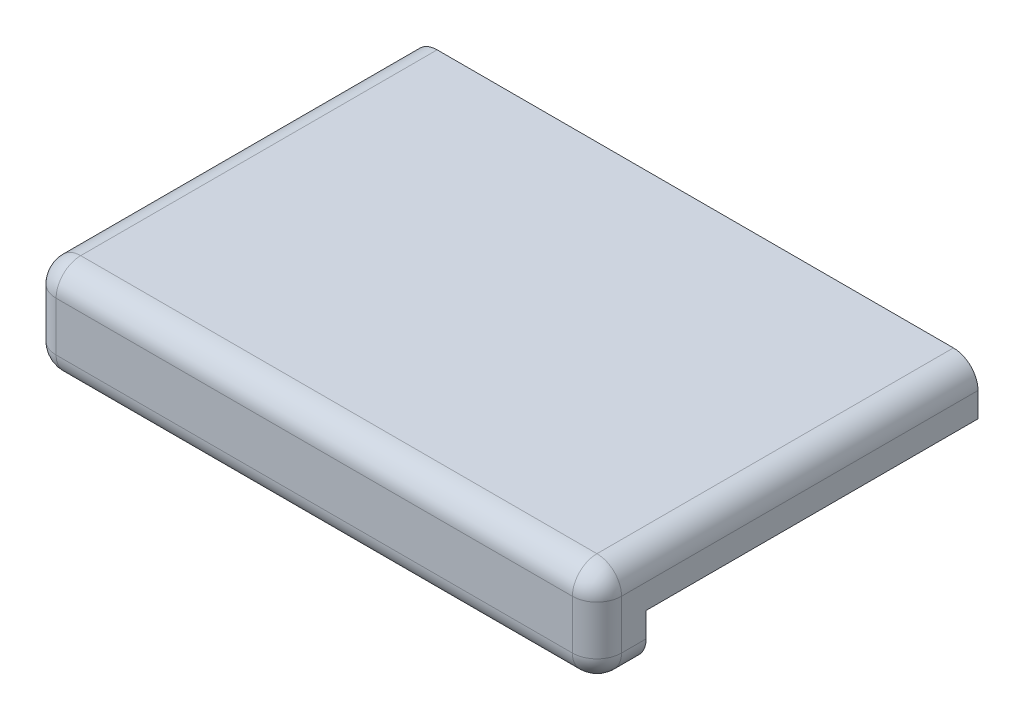
ISO-10303-21;
HEADER;
FILE_DESCRIPTION(('STEP AP214'),'2;1');
FILE_NAME('part.step','',(''),(''),'','','');
FILE_SCHEMA(('AUTOMOTIVE_DESIGN { 1 0 10303 214 1 1 1 1 }'));
ENDSEC;
DATA;
#1=APPLICATION_CONTEXT('core data for automotive mechanical design processes');
#2=APPLICATION_PROTOCOL_DEFINITION('international standard','automotive_design',2000,#1);
#3=PRODUCT_CONTEXT('',#1,'mechanical');
#4=PRODUCT('Part','Part','',(#3));
#5=PRODUCT_RELATED_PRODUCT_CATEGORY('part','',(#4));
#6=PRODUCT_DEFINITION_FORMATION('','',#4);
#7=PRODUCT_DEFINITION_CONTEXT('part definition',#1,'design');
#8=PRODUCT_DEFINITION('design','',#6,#7);
#9=PRODUCT_DEFINITION_SHAPE('','',#8);
#10=(LENGTH_UNIT() NAMED_UNIT(*) SI_UNIT(.MILLI.,.METRE.));
#11=(NAMED_UNIT(*) PLANE_ANGLE_UNIT() SI_UNIT($,.RADIAN.));
#12=(NAMED_UNIT(*) SI_UNIT($,.STERADIAN.) SOLID_ANGLE_UNIT());
#13=UNCERTAINTY_MEASURE_WITH_UNIT(LENGTH_MEASURE(1.E-05),#10,'distance_accuracy_value','');
#14=(GEOMETRIC_REPRESENTATION_CONTEXT(3) GLOBAL_UNCERTAINTY_ASSIGNED_CONTEXT((#13)) GLOBAL_UNIT_ASSIGNED_CONTEXT((#10,
#11,#12)) REPRESENTATION_CONTEXT('',''));
#15=CARTESIAN_POINT('',(0.,0.,0.));
#16=DIRECTION('',(0.,0.,1.));
#17=DIRECTION('',(1.,0.,0.));
#18=AXIS2_PLACEMENT_3D('',#15,#16,#17);
#19=CARTESIAN_POINT('',(-9.24999999999999,20.,-29.));
#20=DIRECTION('',(1.,0.,0.));
#21=DIRECTION('',(0.,0.,-1.));
#22=AXIS2_PLACEMENT_3D('',#19,#20,#21);
#23=SPHERICAL_SURFACE('',#22,2.);
#24=CARTESIAN_POINT('',(-9.24999999999999,20.,-29.));
#25=DIRECTION('',(0.,0.,-1.));
#26=DIRECTION('',(-1.,0.,0.));
#27=AXIS2_PLACEMENT_3D('',#24,#25,#26);
#28=CIRCLE('',#27,2.);
#29=CARTESIAN_POINT('',(-9.24999999999999,18.,-29.));
#30=VERTEX_POINT('',#29);
#31=CARTESIAN_POINT('',(-11.25,20.,-29.));
#32=VERTEX_POINT('',#31);
#33=EDGE_CURVE('E11',#30,#32,#28,.T.);
#34=ORIENTED_EDGE('',*,*,#33,.F.);
#35=CARTESIAN_POINT('',(-9.24999999999999,20.,-29.));
#36=DIRECTION('',(-1.,0.,0.));
#37=DIRECTION('',(0.,0.,1.));
#38=AXIS2_PLACEMENT_3D('',#35,#36,#37);
#39=CIRCLE('',#38,2.);
#40=CARTESIAN_POINT('',(-9.24999999999999,20.,-27.));
#41=VERTEX_POINT('',#40);
#42=EDGE_CURVE('E233',#41,#30,#39,.F.);
#43=ORIENTED_EDGE('',*,*,#42,.F.);
#44=CARTESIAN_POINT('',(-9.24999999999999,20.,-29.));
#45=DIRECTION('',(0.,-1.,0.));
#46=DIRECTION('',(0.,0.,-1.));
#47=AXIS2_PLACEMENT_3D('',#44,#45,#46);
#48=CIRCLE('',#47,2.);
#49=EDGE_CURVE('E46',#41,#32,#48,.T.);
#50=ORIENTED_EDGE('',*,*,#49,.T.);
#51=EDGE_LOOP('',(#34,#43,#50));
#52=FACE_BOUND('',#51,.T.);
#53=ADVANCED_FACE('F38',(#52),#23,.T.);
#54=CARTESIAN_POINT('',(-9.24999999999999,26.,-29.));
#55=DIRECTION('',(0.,-1.,0.));
#56=DIRECTION('',(0.,0.,-1.));
#57=AXIS2_PLACEMENT_3D('',#54,#55,#56);
#58=CYLINDRICAL_SURFACE('',#57,2.);
#59=ORIENTED_EDGE('',*,*,#49,.F.);
#60=DIRECTION('',(0.,-1.,0.));
#61=VECTOR('',#60,1.);
#62=CARTESIAN_POINT('',(-9.24999999999999,26.,-27.));
#63=LINE('',#62,#61);
#64=CARTESIAN_POINT('',(-9.24999999999999,24.,-27.));
#65=VERTEX_POINT('',#64);
#66=EDGE_CURVE('E230',#65,#41,#63,.T.);
#67=ORIENTED_EDGE('',*,*,#66,.F.);
#68=CARTESIAN_POINT('',(-9.24999999999999,24.,-29.));
#69=DIRECTION('',(0.,-1.,0.));
#70=DIRECTION('',(0.,0.,-1.));
#71=AXIS2_PLACEMENT_3D('',#68,#69,#70);
#72=CIRCLE('',#71,2.);
#73=CARTESIAN_POINT('',(-11.25,24.,-29.));
#74=VERTEX_POINT('',#73);
#75=EDGE_CURVE('E242',#65,#74,#72,.T.);
#76=ORIENTED_EDGE('',*,*,#75,.T.);
#77=DIRECTION('',(0.,-1.,0.));
#78=VECTOR('',#77,1.);
#79=CARTESIAN_POINT('',(-11.25,26.,-29.));
#80=LINE('',#79,#78);
#81=EDGE_CURVE('E219',#32,#74,#80,.F.);
#82=ORIENTED_EDGE('',*,*,#81,.F.);
#83=EDGE_LOOP('',(#59,#67,#76,#82));
#84=FACE_BOUND('',#83,.T.);
#85=ADVANCED_FACE('F246',(#84),#58,.T.);
#86=CARTESIAN_POINT('',(-9.24999999999999,24.,-29.));
#87=DIRECTION('',(1.,0.,0.));
#88=DIRECTION('',(0.,0.,-1.));
#89=AXIS2_PLACEMENT_3D('',#86,#87,#88);
#90=SPHERICAL_SURFACE('',#89,2.);
#91=ORIENTED_EDGE('',*,*,#75,.F.);
#92=CARTESIAN_POINT('',(-9.24999999999999,24.,-29.));
#93=DIRECTION('',(1.,0.,0.));
#94=DIRECTION('',(0.,0.,-1.));
#95=AXIS2_PLACEMENT_3D('',#92,#93,#94);
#96=CIRCLE('',#95,2.);
#97=CARTESIAN_POINT('',(-9.24999999999999,26.,-29.));
#98=VERTEX_POINT('',#97);
#99=EDGE_CURVE('E227',#98,#65,#96,.T.);
#100=ORIENTED_EDGE('',*,*,#99,.F.);
#101=CARTESIAN_POINT('',(-9.24999999999999,24.,-29.));
#102=DIRECTION('',(0.,0.,1.));
#103=DIRECTION('',(1.,0.,0.));
#104=AXIS2_PLACEMENT_3D('',#101,#102,#103);
#105=CIRCLE('',#104,2.);
#106=EDGE_CURVE('E239',#98,#74,#105,.T.);
#107=ORIENTED_EDGE('',*,*,#106,.T.);
#108=EDGE_LOOP('',(#91,#100,#107));
#109=FACE_BOUND('',#108,.T.);
#110=ADVANCED_FACE('F278',(#109),#90,.T.);
#111=CARTESIAN_POINT('',(-9.24999999999998,24.,0.));
#112=DIRECTION('',(0.,0.,-1.));
#113=DIRECTION('',(-1.,0.,0.));
#114=AXIS2_PLACEMENT_3D('',#111,#112,#113);
#115=CYLINDRICAL_SURFACE('',#114,2.);
#116=ORIENTED_EDGE('',*,*,#106,.F.);
#117=DIRECTION('',(0.,0.,1.));
#118=VECTOR('',#117,1.);
#119=CARTESIAN_POINT('',(-9.24999999999998,26.,0.));
#120=LINE('',#119,#118);
#121=CARTESIAN_POINT('',(-9.24999999999999,26.,-58.));
#122=VERTEX_POINT('',#121);
#123=EDGE_CURVE('E213',#122,#98,#120,.T.);
#124=ORIENTED_EDGE('',*,*,#123,.F.);
#125=CARTESIAN_POINT('',(-9.24999999999999,24.,-58.));
#126=DIRECTION('',(0.,0.,1.));
#127=DIRECTION('',(1.,0.,0.));
#128=AXIS2_PLACEMENT_3D('',#125,#126,#127);
#129=CIRCLE('',#128,2.);
#130=CARTESIAN_POINT('',(-11.25,24.,-58.));
#131=VERTEX_POINT('',#130);
#132=EDGE_CURVE('E225',#131,#122,#129,.F.);
#133=ORIENTED_EDGE('',*,*,#132,.F.);
#134=DIRECTION('',(0.,0.,1.));
#135=VECTOR('',#134,1.);
#136=CARTESIAN_POINT('',(-11.25,24.,0.));
#137=LINE('',#136,#135);
#138=EDGE_CURVE('E222',#74,#131,#137,.F.);
#139=ORIENTED_EDGE('',*,*,#138,.F.);
#140=EDGE_LOOP('',(#116,#124,#133,#139));
#141=FACE_BOUND('',#140,.T.);
#142=ADVANCED_FACE('F285',(#141),#115,.T.);
#143=CARTESIAN_POINT('',(-9.24999999999998,20.,0.));
#144=DIRECTION('',(0.,0.,1.));
#145=DIRECTION('',(1.,0.,0.));
#146=AXIS2_PLACEMENT_3D('',#143,#144,#145);
#147=CYLINDRICAL_SURFACE('',#146,2.);
#148=DIRECTION('',(0.,0.,-1.));
#149=VECTOR('',#148,1.);
#150=CARTESIAN_POINT('',(-9.24999999999998,18.,0.));
#151=LINE('',#150,#149);
#152=CARTESIAN_POINT('',(-9.24999999999999,18.,-31.));
#153=VERTEX_POINT('',#152);
#154=EDGE_CURVE('E236',#30,#153,#151,.T.);
#155=ORIENTED_EDGE('',*,*,#154,.F.);
#156=ORIENTED_EDGE('',*,*,#33,.T.);
#157=DIRECTION('',(0.,0.,-1.));
#158=VECTOR('',#157,1.);
#159=CARTESIAN_POINT('',(-11.25,20.,0.));
#160=LINE('',#159,#158);
#161=CARTESIAN_POINT('',(-11.25,20.,-31.));
#162=VERTEX_POINT('',#161);
#163=EDGE_CURVE('E216',#162,#32,#160,.F.);
#164=ORIENTED_EDGE('',*,*,#163,.F.);
#165=CARTESIAN_POINT('',(-9.24999999999999,20.,-31.));
#166=DIRECTION('',(0.,0.,1.));
#167=DIRECTION('',(1.,0.,0.));
#168=AXIS2_PLACEMENT_3D('',#165,#166,#167);
#169=CIRCLE('',#168,2.);
#170=EDGE_CURVE('E53',#153,#162,#169,.F.);
#171=ORIENTED_EDGE('',*,*,#170,.F.);
#172=EDGE_LOOP('',(#155,#156,#164,#171));
#173=FACE_BOUND('',#172,.T.);
#174=ADVANCED_FACE('F40',(#173),#147,.T.);
#175=CARTESIAN_POINT('',(32.75,20.,-29.));
#176=DIRECTION('',(-1.,0.,0.));
#177=DIRECTION('',(0.,0.,1.));
#178=AXIS2_PLACEMENT_3D('',#175,#176,#177);
#179=SPHERICAL_SURFACE('',#178,2.);
#180=CARTESIAN_POINT('',(32.75,20.,-29.));
#181=DIRECTION('',(0.,0.,-1.));
#182=DIRECTION('',(-1.,0.,0.));
#183=AXIS2_PLACEMENT_3D('',#180,#181,#182);
#184=CIRCLE('',#183,2.);
#185=CARTESIAN_POINT('',(34.75,20.,-29.));
#186=VERTEX_POINT('',#185);
#187=CARTESIAN_POINT('',(32.75,18.,-29.));
#188=VERTEX_POINT('',#187);
#189=EDGE_CURVE('E211',#186,#188,#184,.T.);
#190=ORIENTED_EDGE('',*,*,#189,.F.);
#191=CARTESIAN_POINT('',(32.75,20.,-29.));
#192=DIRECTION('',(0.,-1.,0.));
#193=DIRECTION('',(0.,0.,-1.));
#194=AXIS2_PLACEMENT_3D('',#191,#192,#193);
#195=CIRCLE('',#194,2.);
#196=CARTESIAN_POINT('',(32.75,20.,-27.));
#197=VERTEX_POINT('',#196);
#198=EDGE_CURVE('E208',#186,#197,#195,.T.);
#199=ORIENTED_EDGE('',*,*,#198,.T.);
#200=CARTESIAN_POINT('',(32.75,20.,-29.));
#201=DIRECTION('',(-1.,0.,0.));
#202=DIRECTION('',(0.,0.,1.));
#203=AXIS2_PLACEMENT_3D('',#200,#201,#202);
#204=CIRCLE('',#203,2.);
#205=EDGE_CURVE('E195',#188,#197,#204,.T.);
#206=ORIENTED_EDGE('',*,*,#205,.F.);
#207=EDGE_LOOP('',(#190,#199,#206));
#208=FACE_BOUND('',#207,.T.);
#209=ADVANCED_FACE('F259',(#208),#179,.T.);
#210=CARTESIAN_POINT('',(32.75,26.,-29.));
#211=DIRECTION('',(0.,-1.,0.));
#212=DIRECTION('',(0.,0.,-1.));
#213=AXIS2_PLACEMENT_3D('',#210,#211,#212);
#214=CYLINDRICAL_SURFACE('',#213,2.);
#215=ORIENTED_EDGE('',*,*,#198,.F.);
#216=DIRECTION('',(0.,-1.,0.));
#217=VECTOR('',#216,1.);
#218=CARTESIAN_POINT('',(34.75,26.,-29.));
#219=LINE('',#218,#217);
#220=CARTESIAN_POINT('',(34.75,24.,-29.));
#221=VERTEX_POINT('',#220);
#222=EDGE_CURVE('E179',#221,#186,#219,.T.);
#223=ORIENTED_EDGE('',*,*,#222,.F.);
#224=CARTESIAN_POINT('',(32.75,24.,-29.));
#225=DIRECTION('',(0.,-1.,0.));
#226=DIRECTION('',(0.,0.,-1.));
#227=AXIS2_PLACEMENT_3D('',#224,#225,#226);
#228=CIRCLE('',#227,2.);
#229=CARTESIAN_POINT('',(32.75,24.,-27.));
#230=VERTEX_POINT('',#229);
#231=EDGE_CURVE('E206',#221,#230,#228,.T.);
#232=ORIENTED_EDGE('',*,*,#231,.T.);
#233=DIRECTION('',(0.,-1.,0.));
#234=VECTOR('',#233,1.);
#235=CARTESIAN_POINT('',(32.75,26.,-27.));
#236=LINE('',#235,#234);
#237=EDGE_CURVE('E192',#197,#230,#236,.F.);
#238=ORIENTED_EDGE('',*,*,#237,.F.);
#239=EDGE_LOOP('',(#215,#223,#232,#238));
#240=FACE_BOUND('',#239,.T.);
#241=ADVANCED_FACE('F263',(#240),#214,.T.);
#242=CARTESIAN_POINT('',(32.75,24.,-29.));
#243=DIRECTION('',(-1.,0.,0.));
#244=DIRECTION('',(0.,0.,1.));
#245=AXIS2_PLACEMENT_3D('',#242,#243,#244);
#246=SPHERICAL_SURFACE('',#245,2.);
#247=ORIENTED_EDGE('',*,*,#231,.F.);
#248=CARTESIAN_POINT('',(32.75,24.,-29.));
#249=DIRECTION('',(0.,0.,1.));
#250=DIRECTION('',(1.,0.,0.));
#251=AXIS2_PLACEMENT_3D('',#248,#249,#250);
#252=CIRCLE('',#251,2.);
#253=CARTESIAN_POINT('',(32.75,26.,-29.));
#254=VERTEX_POINT('',#253);
#255=EDGE_CURVE('E203',#221,#254,#252,.T.);
#256=ORIENTED_EDGE('',*,*,#255,.T.);
#257=CARTESIAN_POINT('',(32.75,24.,-29.));
#258=DIRECTION('',(1.,0.,0.));
#259=DIRECTION('',(0.,0.,-1.));
#260=AXIS2_PLACEMENT_3D('',#257,#258,#259);
#261=CIRCLE('',#260,2.);
#262=EDGE_CURVE('E189',#230,#254,#261,.F.);
#263=ORIENTED_EDGE('',*,*,#262,.F.);
#264=EDGE_LOOP('',(#247,#256,#263));
#265=FACE_BOUND('',#264,.T.);
#266=ADVANCED_FACE('F270',(#265),#246,.T.);
#267=CARTESIAN_POINT('',(32.75,24.,-58.));
#268=DIRECTION('',(0.,0.,-1.));
#269=DIRECTION('',(-1.,0.,0.));
#270=AXIS2_PLACEMENT_3D('',#267,#268,#269);
#271=CYLINDRICAL_SURFACE('',#270,2.);
#272=ORIENTED_EDGE('',*,*,#255,.F.);
#273=DIRECTION('',(0.,0.,1.));
#274=VECTOR('',#273,1.);
#275=CARTESIAN_POINT('',(34.75,24.,-58.));
#276=LINE('',#275,#274);
#277=CARTESIAN_POINT('',(34.75,24.,-58.));
#278=VERTEX_POINT('',#277);
#279=EDGE_CURVE('E181',#278,#221,#276,.T.);
#280=ORIENTED_EDGE('',*,*,#279,.F.);
#281=CARTESIAN_POINT('',(32.75,24.,-58.));
#282=DIRECTION('',(0.,0.,1.));
#283=DIRECTION('',(1.,0.,0.));
#284=AXIS2_PLACEMENT_3D('',#281,#282,#283);
#285=CIRCLE('',#284,2.);
#286=CARTESIAN_POINT('',(32.75,26.,-58.));
#287=VERTEX_POINT('',#286);
#288=EDGE_CURVE('E187',#287,#278,#285,.F.);
#289=ORIENTED_EDGE('',*,*,#288,.F.);
#290=DIRECTION('',(0.,0.,1.));
#291=VECTOR('',#290,1.);
#292=CARTESIAN_POINT('',(32.75,26.,-58.));
#293=LINE('',#292,#291);
#294=EDGE_CURVE('E184',#254,#287,#293,.F.);
#295=ORIENTED_EDGE('',*,*,#294,.F.);
#296=EDGE_LOOP('',(#272,#280,#289,#295));
#297=FACE_BOUND('',#296,.T.);
#298=ADVANCED_FACE('F291',(#297),#271,.T.);
#299=CARTESIAN_POINT('',(32.75,20.,-58.));
#300=DIRECTION('',(0.,0.,1.));
#301=DIRECTION('',(1.,0.,0.));
#302=AXIS2_PLACEMENT_3D('',#299,#300,#301);
#303=CYLINDRICAL_SURFACE('',#302,2.);
#304=DIRECTION('',(0.,0.,-1.));
#305=VECTOR('',#304,1.);
#306=CARTESIAN_POINT('',(34.75,20.,-58.));
#307=LINE('',#306,#305);
#308=CARTESIAN_POINT('',(34.75,20.,-31.));
#309=VERTEX_POINT('',#308);
#310=EDGE_CURVE('E135',#186,#309,#307,.T.);
#311=ORIENTED_EDGE('',*,*,#310,.F.);
#312=ORIENTED_EDGE('',*,*,#189,.T.);
#313=DIRECTION('',(0.,0.,-1.));
#314=VECTOR('',#313,1.);
#315=CARTESIAN_POINT('',(32.75,18.,-58.));
#316=LINE('',#315,#314);
#317=CARTESIAN_POINT('',(32.75,18.,-31.));
#318=VERTEX_POINT('',#317);
#319=EDGE_CURVE('E198',#318,#188,#316,.F.);
#320=ORIENTED_EDGE('',*,*,#319,.F.);
#321=CARTESIAN_POINT('',(32.75,20.,-31.));
#322=DIRECTION('',(0.,0.,1.));
#323=DIRECTION('',(1.,0.,0.));
#324=AXIS2_PLACEMENT_3D('',#321,#322,#323);
#325=CIRCLE('',#324,2.);
#326=EDGE_CURVE('E201',#309,#318,#325,.F.);
#327=ORIENTED_EDGE('',*,*,#326,.F.);
#328=EDGE_LOOP('',(#311,#312,#320,#327));
#329=FACE_BOUND('',#328,.T.);
#330=ADVANCED_FACE('F293',(#329),#303,.T.);
#331=CARTESIAN_POINT('',(-11.25,20.,-29.));
#332=DIRECTION('',(-1.,0.,0.));
#333=DIRECTION('',(0.,0.,1.));
#334=AXIS2_PLACEMENT_3D('',#331,#332,#333);
#335=CYLINDRICAL_SURFACE('',#334,2.);
#336=DIRECTION('',(1.,0.,0.));
#337=VECTOR('',#336,1.);
#338=CARTESIAN_POINT('',(-11.25,20.,-27.));
#339=LINE('',#338,#337);
#340=EDGE_CURVE('E173',#41,#197,#339,.T.);
#341=ORIENTED_EDGE('',*,*,#340,.F.);
#342=ORIENTED_EDGE('',*,*,#42,.T.);
#343=DIRECTION('',(1.,0.,0.));
#344=VECTOR('',#343,1.);
#345=CARTESIAN_POINT('',(-11.25,18.,-29.));
#346=LINE('',#345,#344);
#347=EDGE_CURVE('E175',#188,#30,#346,.F.);
#348=ORIENTED_EDGE('',*,*,#347,.F.);
#349=ORIENTED_EDGE('',*,*,#205,.T.);
#350=EDGE_LOOP('',(#341,#342,#348,#349));
#351=FACE_BOUND('',#350,.T.);
#352=ADVANCED_FACE('F253',(#351),#335,.T.);
#353=CARTESIAN_POINT('',(-11.25,24.,-29.));
#354=DIRECTION('',(1.,0.,0.));
#355=DIRECTION('',(0.,0.,-1.));
#356=AXIS2_PLACEMENT_3D('',#353,#354,#355);
#357=CYLINDRICAL_SURFACE('',#356,2.);
#358=DIRECTION('',(-1.,0.,0.));
#359=VECTOR('',#358,1.);
#360=CARTESIAN_POINT('',(-11.25,26.,-29.));
#361=LINE('',#360,#359);
#362=EDGE_CURVE('E171',#98,#254,#361,.F.);
#363=ORIENTED_EDGE('',*,*,#362,.F.);
#364=ORIENTED_EDGE('',*,*,#99,.T.);
#365=DIRECTION('',(-1.,0.,0.));
#366=VECTOR('',#365,1.);
#367=CARTESIAN_POINT('',(-11.25,24.,-27.));
#368=LINE('',#367,#366);
#369=EDGE_CURVE('E168',#230,#65,#368,.T.);
#370=ORIENTED_EDGE('',*,*,#369,.F.);
#371=ORIENTED_EDGE('',*,*,#262,.T.);
#372=EDGE_LOOP('',(#363,#364,#370,#371));
#373=FACE_BOUND('',#372,.T.);
#374=ADVANCED_FACE('F275',(#373),#357,.T.);
#375=CARTESIAN_POINT('',(0.,22.,0.));
#376=DIRECTION('',(0.,1.,0.));
#377=DIRECTION('',(0.,0.,1.));
#378=AXIS2_PLACEMENT_3D('',#375,#376,#377);
#379=PLANE('',#378);
#380=DIRECTION('',(1.,0.,0.));
#381=VECTOR('',#380,1.);
#382=CARTESIAN_POINT('',(-11.25,22.,-31.));
#383=LINE('',#382,#381);
#384=CARTESIAN_POINT('',(-11.25,22.,-31.));
#385=VERTEX_POINT('',#384);
#386=CARTESIAN_POINT('',(34.75,22.,-31.));
#387=VERTEX_POINT('',#386);
#388=EDGE_CURVE('E146',#385,#387,#383,.T.);
#389=ORIENTED_EDGE('',*,*,#388,.F.);
#390=DIRECTION('',(0.,0.,1.));
#391=VECTOR('',#390,1.);
#392=CARTESIAN_POINT('',(-11.25,22.,-58.));
#393=LINE('',#392,#391);
#394=CARTESIAN_POINT('',(-11.25,22.,-58.));
#395=VERTEX_POINT('',#394);
#396=EDGE_CURVE('E150',#395,#385,#393,.T.);
#397=ORIENTED_EDGE('',*,*,#396,.F.);
#398=DIRECTION('',(-1.,0.,0.));
#399=VECTOR('',#398,1.);
#400=CARTESIAN_POINT('',(-11.25,22.,-58.));
#401=LINE('',#400,#399);
#402=CARTESIAN_POINT('',(34.75,22.,-58.));
#403=VERTEX_POINT('',#402);
#404=EDGE_CURVE('E149',#403,#395,#401,.T.);
#405=ORIENTED_EDGE('',*,*,#404,.F.);
#406=DIRECTION('',(0.,0.,-1.));
#407=VECTOR('',#406,1.);
#408=CARTESIAN_POINT('',(34.75,22.,-58.));
#409=LINE('',#408,#407);
#410=EDGE_CURVE('E131',#387,#403,#409,.T.);
#411=ORIENTED_EDGE('',*,*,#410,.F.);
#412=EDGE_LOOP('',(#389,#397,#405,#411));
#413=FACE_BOUND('',#412,.T.);
#414=ADVANCED_FACE('F144',(#413),#379,.F.);
#415=CARTESIAN_POINT('',(-11.25,26.,-58.));
#416=DIRECTION('',(1.,0.,0.));
#417=DIRECTION('',(0.,0.,-1.));
#418=AXIS2_PLACEMENT_3D('',#415,#416,#417);
#419=PLANE('',#418);
#420=ORIENTED_EDGE('',*,*,#81,.T.);
#421=ORIENTED_EDGE('',*,*,#138,.T.);
#422=DIRECTION('',(0.,-1.,0.));
#423=VECTOR('',#422,1.);
#424=CARTESIAN_POINT('',(-11.25,26.,-58.));
#425=LINE('',#424,#423);
#426=EDGE_CURVE('E162',#131,#395,#425,.T.);
#427=ORIENTED_EDGE('',*,*,#426,.T.);
#428=ORIENTED_EDGE('',*,*,#396,.T.);
#429=DIRECTION('',(0.,1.,0.));
#430=VECTOR('',#429,1.);
#431=CARTESIAN_POINT('',(-11.25,18.,-31.));
#432=LINE('',#431,#430);
#433=EDGE_CURVE('E139',#162,#385,#432,.T.);
#434=ORIENTED_EDGE('',*,*,#433,.F.);
#435=ORIENTED_EDGE('',*,*,#163,.T.);
#436=EDGE_LOOP('',(#420,#421,#427,#428,#434,#435));
#437=FACE_BOUND('',#436,.T.);
#438=ADVANCED_FACE('F248',(#437),#419,.F.);
#439=CARTESIAN_POINT('',(-11.25,26.,-27.));
#440=DIRECTION('',(0.,0.,-1.));
#441=DIRECTION('',(-1.,0.,0.));
#442=AXIS2_PLACEMENT_3D('',#439,#440,#441);
#443=PLANE('',#442);
#444=ORIENTED_EDGE('',*,*,#369,.T.);
#445=ORIENTED_EDGE('',*,*,#66,.T.);
#446=ORIENTED_EDGE('',*,*,#340,.T.);
#447=ORIENTED_EDGE('',*,*,#237,.T.);
#448=EDGE_LOOP('',(#444,#445,#446,#447));
#449=FACE_BOUND('',#448,.T.);
#450=ADVANCED_FACE('F267',(#449),#443,.F.);
#451=CARTESIAN_POINT('',(34.75,26.,-58.));
#452=DIRECTION('',(-1.,0.,0.));
#453=DIRECTION('',(0.,0.,1.));
#454=AXIS2_PLACEMENT_3D('',#451,#452,#453);
#455=PLANE('',#454);
#456=DIRECTION('',(0.,-1.,0.));
#457=VECTOR('',#456,1.);
#458=CARTESIAN_POINT('',(34.75,26.,-58.));
#459=LINE('',#458,#457);
#460=EDGE_CURVE('E166',#278,#403,#459,.T.);
#461=ORIENTED_EDGE('',*,*,#460,.F.);
#462=ORIENTED_EDGE('',*,*,#279,.T.);
#463=ORIENTED_EDGE('',*,*,#222,.T.);
#464=ORIENTED_EDGE('',*,*,#310,.T.);
#465=DIRECTION('',(0.,1.,0.));
#466=VECTOR('',#465,1.);
#467=CARTESIAN_POINT('',(34.75,18.,-31.));
#468=LINE('',#467,#466);
#469=EDGE_CURVE('E127',#309,#387,#468,.T.);
#470=ORIENTED_EDGE('',*,*,#469,.T.);
#471=ORIENTED_EDGE('',*,*,#410,.T.);
#472=EDGE_LOOP('',(#461,#462,#463,#464,#470,#471));
#473=FACE_BOUND('',#472,.T.);
#474=ADVANCED_FACE('F130',(#473),#455,.F.);
#475=CARTESIAN_POINT('',(-11.25,26.,-58.));
#476=DIRECTION('',(0.,0.,1.));
#477=DIRECTION('',(1.,0.,0.));
#478=AXIS2_PLACEMENT_3D('',#475,#476,#477);
#479=PLANE('',#478);
#480=ORIENTED_EDGE('',*,*,#426,.F.);
#481=ORIENTED_EDGE('',*,*,#132,.T.);
#482=DIRECTION('',(-1.,0.,0.));
#483=VECTOR('',#482,1.);
#484=CARTESIAN_POINT('',(-11.25,26.,-58.));
#485=LINE('',#484,#483);
#486=EDGE_CURVE('E159',#287,#122,#485,.T.);
#487=ORIENTED_EDGE('',*,*,#486,.F.);
#488=ORIENTED_EDGE('',*,*,#288,.T.);
#489=ORIENTED_EDGE('',*,*,#460,.T.);
#490=ORIENTED_EDGE('',*,*,#404,.T.);
#491=EDGE_LOOP('',(#480,#481,#487,#488,#489,#490));
#492=FACE_BOUND('',#491,.T.);
#493=ADVANCED_FACE('F288',(#492),#479,.F.);
#494=CARTESIAN_POINT('',(0.,26.,0.));
#495=DIRECTION('',(0.,1.,0.));
#496=DIRECTION('',(0.,0.,1.));
#497=AXIS2_PLACEMENT_3D('',#494,#495,#496);
#498=PLANE('',#497);
#499=ORIENTED_EDGE('',*,*,#486,.T.);
#500=ORIENTED_EDGE('',*,*,#123,.T.);
#501=ORIENTED_EDGE('',*,*,#362,.T.);
#502=ORIENTED_EDGE('',*,*,#294,.T.);
#503=EDGE_LOOP('',(#499,#500,#501,#502));
#504=FACE_BOUND('',#503,.T.);
#505=ADVANCED_FACE('F282',(#504),#498,.T.);
#506=CARTESIAN_POINT('',(-11.25,18.,-31.));
#507=DIRECTION('',(0.,0.,1.));
#508=DIRECTION('',(1.,0.,0.));
#509=AXIS2_PLACEMENT_3D('',#506,#507,#508);
#510=PLANE('',#509);
#511=DIRECTION('',(1.,0.,0.));
#512=VECTOR('',#511,1.);
#513=CARTESIAN_POINT('',(-11.25,18.,-31.));
#514=LINE('',#513,#512);
#515=EDGE_CURVE('E140',#153,#318,#514,.T.);
#516=ORIENTED_EDGE('',*,*,#515,.F.);
#517=ORIENTED_EDGE('',*,*,#170,.T.);
#518=ORIENTED_EDGE('',*,*,#433,.T.);
#519=ORIENTED_EDGE('',*,*,#388,.T.);
#520=ORIENTED_EDGE('',*,*,#469,.F.);
#521=ORIENTED_EDGE('',*,*,#326,.T.);
#522=EDGE_LOOP('',(#516,#517,#518,#519,#520,#521));
#523=FACE_BOUND('',#522,.T.);
#524=ADVANCED_FACE('F153',(#523),#510,.F.);
#525=CARTESIAN_POINT('',(0.,18.,0.));
#526=DIRECTION('',(0.,-1.,0.));
#527=DIRECTION('',(0.,0.,-1.));
#528=AXIS2_PLACEMENT_3D('',#525,#526,#527);
#529=PLANE('',#528);
#530=ORIENTED_EDGE('',*,*,#347,.T.);
#531=ORIENTED_EDGE('',*,*,#154,.T.);
#532=ORIENTED_EDGE('',*,*,#515,.T.);
#533=ORIENTED_EDGE('',*,*,#319,.T.);
#534=EDGE_LOOP('',(#530,#531,#532,#533));
#535=FACE_BOUND('',#534,.T.);
#536=ADVANCED_FACE('F254',(#535),#529,.T.);
#537=CLOSED_SHELL('',(#53,#85,#110,#142,#174,#209,#241,#266,#298,#330,#352,#374,#414,#438,#450,
#474,#493,#505,#524,#536));
#538=MANIFOLD_SOLID_BREP('B2',#537);
#539=ADVANCED_BREP_SHAPE_REPRESENTATION('',(#18,#538),#14);
#540=SHAPE_DEFINITION_REPRESENTATION(#9,#539);
ENDSEC;
END-ISO-10303-21;
